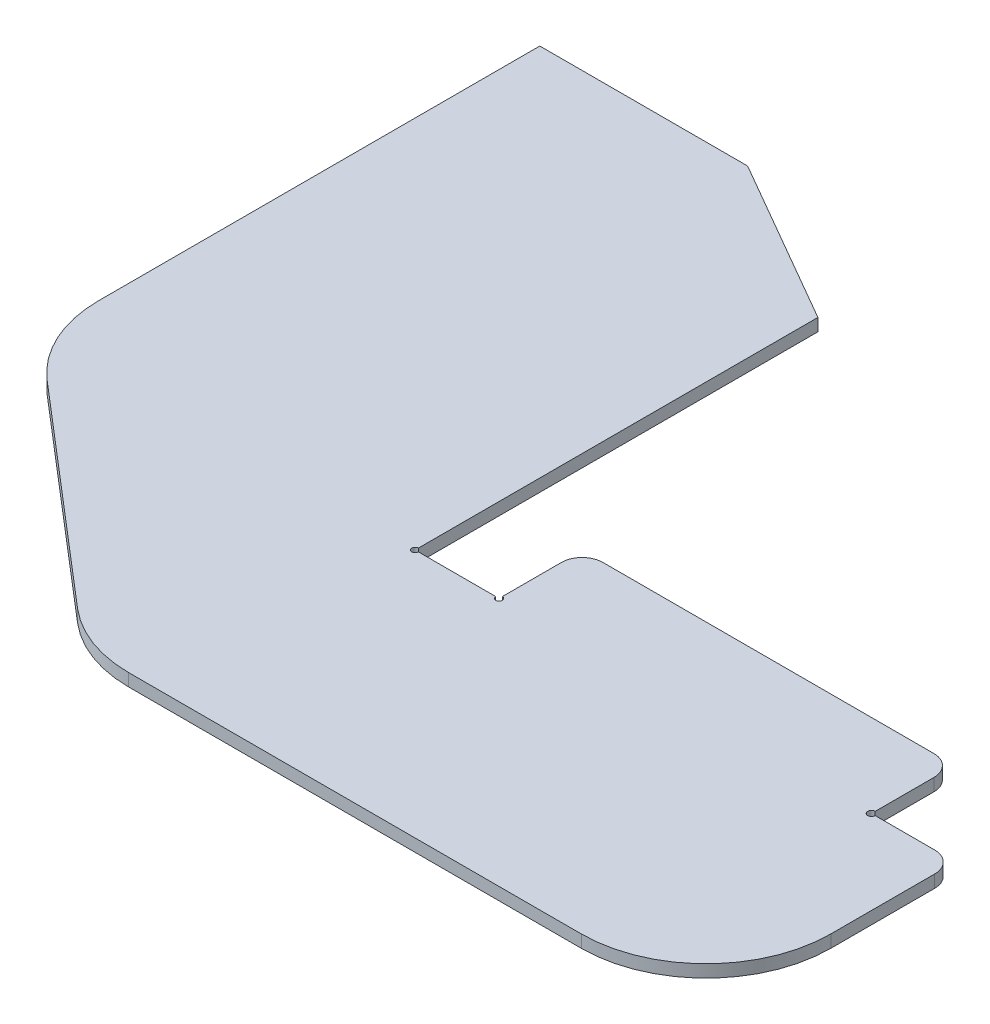
ISO-10303-21;
HEADER;
FILE_DESCRIPTION(('STEP AP214'),'2;1');
FILE_NAME('part.step','',(''),(''),'','','');
FILE_SCHEMA(('AUTOMOTIVE_DESIGN { 1 0 10303 214 1 1 1 1 }'));
ENDSEC;
DATA;
#1=APPLICATION_CONTEXT('core data for automotive mechanical design processes');
#2=APPLICATION_PROTOCOL_DEFINITION('international standard','automotive_design',2000,#1);
#3=PRODUCT_CONTEXT('',#1,'mechanical');
#4=PRODUCT('Part','Part','',(#3));
#5=PRODUCT_RELATED_PRODUCT_CATEGORY('part','',(#4));
#6=PRODUCT_DEFINITION_FORMATION('','',#4);
#7=PRODUCT_DEFINITION_CONTEXT('part definition',#1,'design');
#8=PRODUCT_DEFINITION('design','',#6,#7);
#9=PRODUCT_DEFINITION_SHAPE('','',#8);
#10=(LENGTH_UNIT() NAMED_UNIT(*) SI_UNIT(.MILLI.,.METRE.));
#11=(NAMED_UNIT(*) PLANE_ANGLE_UNIT() SI_UNIT($,.RADIAN.));
#12=(NAMED_UNIT(*) SI_UNIT($,.STERADIAN.) SOLID_ANGLE_UNIT());
#13=UNCERTAINTY_MEASURE_WITH_UNIT(LENGTH_MEASURE(1.E-05),#10,'distance_accuracy_value','');
#14=(GEOMETRIC_REPRESENTATION_CONTEXT(3) GLOBAL_UNCERTAINTY_ASSIGNED_CONTEXT((#13)) GLOBAL_UNIT_ASSIGNED_CONTEXT((#10,
#11,#12)) REPRESENTATION_CONTEXT('',''));
#15=CARTESIAN_POINT('',(0.,0.,0.));
#16=DIRECTION('',(0.,0.,1.));
#17=DIRECTION('',(1.,0.,0.));
#18=AXIS2_PLACEMENT_3D('',#15,#16,#17);
#19=CARTESIAN_POINT('',(-75.,3.,-30.));
#20=DIRECTION('',(0.,0.,1.));
#21=DIRECTION('',(1.,0.,0.));
#22=AXIS2_PLACEMENT_3D('',#19,#20,#21);
#23=PLANE('',#22);
#24=DIRECTION('',(-1.,0.,0.));
#25=VECTOR('',#24,1.);
#26=CARTESIAN_POINT('',(-75.,0.,-30.));
#27=LINE('',#26,#25);
#28=CARTESIAN_POINT('',(-35.6,0.,-30.));
#29=VERTEX_POINT('',#28);
#30=CARTESIAN_POINT('',(-54.2,0.,-30.));
#31=VERTEX_POINT('',#30);
#32=EDGE_CURVE('E278',#29,#31,#27,.T.);
#33=ORIENTED_EDGE('',*,*,#32,.T.);
#34=DIRECTION('',(0.,1.,0.));
#35=VECTOR('',#34,1.);
#36=CARTESIAN_POINT('',(-54.2,0.,-30.));
#37=LINE('',#36,#35);
#38=CARTESIAN_POINT('',(-54.2,3.,-30.));
#39=VERTEX_POINT('',#38);
#40=EDGE_CURVE('E234',#31,#39,#37,.T.);
#41=ORIENTED_EDGE('',*,*,#40,.T.);
#42=DIRECTION('',(-1.,0.,0.));
#43=VECTOR('',#42,1.);
#44=CARTESIAN_POINT('',(-75.,3.,-30.));
#45=LINE('',#44,#43);
#46=CARTESIAN_POINT('',(-35.6,3.,-30.));
#47=VERTEX_POINT('',#46);
#48=EDGE_CURVE('E269',#47,#39,#45,.T.);
#49=ORIENTED_EDGE('',*,*,#48,.F.);
#50=DIRECTION('',(0.,1.,0.));
#51=VECTOR('',#50,1.);
#52=CARTESIAN_POINT('',(-35.6,0.,-30.));
#53=LINE('',#52,#51);
#54=EDGE_CURVE('E231',#47,#29,#53,.F.);
#55=ORIENTED_EDGE('',*,*,#54,.T.);
#56=EDGE_LOOP('',(#33,#41,#49,#55));
#57=FACE_BOUND('',#56,.T.);
#58=ADVANCED_FACE('F35',(#57),#23,.F.);
#59=CARTESIAN_POINT('',(75.,3.,30.));
#60=DIRECTION('',(-1.,0.,0.));
#61=DIRECTION('',(0.,0.,1.));
#62=AXIS2_PLACEMENT_3D('',#59,#60,#61);
#63=PLANE('',#62);
#64=DIRECTION('',(0.,0.,-1.));
#65=VECTOR('',#64,1.);
#66=CARTESIAN_POINT('',(75.,0.,30.));
#67=LINE('',#66,#65);
#68=CARTESIAN_POINT('',(75.,0.,0.));
#69=VERTEX_POINT('',#68);
#70=CARTESIAN_POINT('',(75.,0.,-25.));
#71=VERTEX_POINT('',#70);
#72=EDGE_CURVE('E261',#69,#71,#67,.T.);
#73=ORIENTED_EDGE('',*,*,#72,.T.);
#74=DIRECTION('',(0.,-1.,0.));
#75=VECTOR('',#74,1.);
#76=CARTESIAN_POINT('',(75.,3.,-25.));
#77=LINE('',#76,#75);
#78=CARTESIAN_POINT('',(75.,3.,-25.));
#79=VERTEX_POINT('',#78);
#80=EDGE_CURVE('E326',#71,#79,#77,.F.);
#81=ORIENTED_EDGE('',*,*,#80,.T.);
#82=DIRECTION('',(0.,0.,-1.));
#83=VECTOR('',#82,1.);
#84=CARTESIAN_POINT('',(75.,3.,30.));
#85=LINE('',#84,#83);
#86=CARTESIAN_POINT('',(75.,3.,0.));
#87=VERTEX_POINT('',#86);
#88=EDGE_CURVE('E267',#87,#79,#85,.T.);
#89=ORIENTED_EDGE('',*,*,#88,.F.);
#90=DIRECTION('',(0.,-1.,0.));
#91=VECTOR('',#90,1.);
#92=CARTESIAN_POINT('',(75.,3.,0.));
#93=LINE('',#92,#91);
#94=EDGE_CURVE('E275',#87,#69,#93,.T.);
#95=ORIENTED_EDGE('',*,*,#94,.T.);
#96=EDGE_LOOP('',(#73,#81,#89,#95));
#97=FACE_BOUND('',#96,.T.);
#98=ADVANCED_FACE('F367',(#97),#63,.F.);
#99=CARTESIAN_POINT('',(70.,3.,-30.));
#100=VERTEX_POINT('',#99);
#101=CARTESIAN_POINT('',(55.6994021051872,3.,-30.));
#102=VERTEX_POINT('',#101);
#103=EDGE_CURVE('E271',#100,#102,#45,.T.);
#104=ORIENTED_EDGE('',*,*,#103,.F.);
#105=DIRECTION('',(0.,-1.,0.));
#106=VECTOR('',#105,1.);
#107=CARTESIAN_POINT('',(70.,3.,-30.));
#108=LINE('',#107,#106);
#109=CARTESIAN_POINT('',(70.,0.,-30.));
#110=VERTEX_POINT('',#109);
#111=EDGE_CURVE('E317',#100,#110,#108,.T.);
#112=ORIENTED_EDGE('',*,*,#111,.T.);
#113=CARTESIAN_POINT('',(55.6994021051872,0.,-30.));
#114=VERTEX_POINT('',#113);
#115=EDGE_CURVE('E279',#110,#114,#27,.T.);
#116=ORIENTED_EDGE('',*,*,#115,.T.);
#117=DIRECTION('',(0.,1.,0.));
#118=VECTOR('',#117,1.);
#119=CARTESIAN_POINT('',(55.6994021051872,0.,-30.));
#120=LINE('',#119,#118);
#121=EDGE_CURVE('E216',#114,#102,#120,.T.);
#122=ORIENTED_EDGE('',*,*,#121,.T.);
#123=EDGE_LOOP('',(#104,#112,#116,#122));
#124=FACE_BOUND('',#123,.T.);
#125=ADVANCED_FACE('F361',(#124),#23,.F.);
#126=CARTESIAN_POINT('',(-75.,3.,30.));
#127=DIRECTION('',(0.,0.,-1.));
#128=DIRECTION('',(-1.,0.,0.));
#129=AXIS2_PLACEMENT_3D('',#126,#127,#128);
#130=PLANE('',#129);
#131=DIRECTION('',(1.,0.,0.));
#132=VECTOR('',#131,1.);
#133=CARTESIAN_POINT('',(-75.,3.,30.));
#134=LINE('',#133,#132);
#135=CARTESIAN_POINT('',(-63.9022777135355,3.,30.));
#136=VERTEX_POINT('',#135);
#137=CARTESIAN_POINT('',(45.,3.,30.));
#138=VERTEX_POINT('',#137);
#139=EDGE_CURVE('E273',#136,#138,#134,.T.);
#140=ORIENTED_EDGE('',*,*,#139,.F.);
#141=DIRECTION('',(0.,-1.,0.));
#142=VECTOR('',#141,1.);
#143=CARTESIAN_POINT('',(-63.9022777135355,0.,30.));
#144=LINE('',#143,#142);
#145=CARTESIAN_POINT('',(-63.9022777135355,0.,30.));
#146=VERTEX_POINT('',#145);
#147=EDGE_CURVE('E292',#136,#146,#144,.T.);
#148=ORIENTED_EDGE('',*,*,#147,.T.);
#149=DIRECTION('',(1.,0.,0.));
#150=VECTOR('',#149,1.);
#151=CARTESIAN_POINT('',(-75.,0.,30.));
#152=LINE('',#151,#150);
#153=CARTESIAN_POINT('',(45.,0.,30.));
#154=VERTEX_POINT('',#153);
#155=EDGE_CURVE('E270',#146,#154,#152,.T.);
#156=ORIENTED_EDGE('',*,*,#155,.T.);
#157=DIRECTION('',(0.,-1.,0.));
#158=VECTOR('',#157,1.);
#159=CARTESIAN_POINT('',(45.,3.,30.));
#160=LINE('',#159,#158);
#161=EDGE_CURVE('E287',#154,#138,#160,.F.);
#162=ORIENTED_EDGE('',*,*,#161,.T.);
#163=EDGE_LOOP('',(#140,#148,#156,#162));
#164=FACE_BOUND('',#163,.T.);
#165=ADVANCED_FACE('F380',(#164),#130,.F.);
#166=CARTESIAN_POINT('',(0.,3.,0.));
#167=DIRECTION('',(0.,-1.,0.));
#168=DIRECTION('',(0.,0.,-1.));
#169=AXIS2_PLACEMENT_3D('',#166,#167,#168);
#170=PLANE('',#169);
#171=ORIENTED_EDGE('',*,*,#88,.T.);
#172=CARTESIAN_POINT('',(70.,3.,-25.));
#173=DIRECTION('',(0.,-1.,0.));
#174=DIRECTION('',(0.,0.,-1.));
#175=AXIS2_PLACEMENT_3D('',#172,#173,#174);
#176=CIRCLE('',#175,5.);
#177=EDGE_CURVE('E331',#79,#100,#176,.F.);
#178=ORIENTED_EDGE('',*,*,#177,.T.);
#179=ORIENTED_EDGE('',*,*,#103,.T.);
#180=CARTESIAN_POINT('',(54.8,3.,-30.));
#181=DIRECTION('',(0.,1.,0.));
#182=DIRECTION('',(0.,0.,1.));
#183=AXIS2_PLACEMENT_3D('',#180,#181,#182);
#184=CIRCLE('',#183,0.899402105187145);
#185=CARTESIAN_POINT('',(54.8,3.,-30.8994021051871));
#186=VERTEX_POINT('',#185);
#187=EDGE_CURVE('E189',#186,#102,#184,.T.);
#188=ORIENTED_EDGE('',*,*,#187,.F.);
#189=DIRECTION('',(0.,0.,-1.));
#190=VECTOR('',#189,1.);
#191=CARTESIAN_POINT('',(54.8,3.,0.));
#192=LINE('',#191,#190);
#193=CARTESIAN_POINT('',(54.8,3.,-45.));
#194=VERTEX_POINT('',#193);
#195=EDGE_CURVE('E241',#186,#194,#192,.T.);
#196=ORIENTED_EDGE('',*,*,#195,.T.);
#197=CARTESIAN_POINT('',(49.8,3.,-45.));
#198=DIRECTION('',(0.,-1.,0.));
#199=DIRECTION('',(0.,0.,-1.));
#200=AXIS2_PLACEMENT_3D('',#197,#198,#199);
#201=CIRCLE('',#200,5.);
#202=CARTESIAN_POINT('',(49.8,3.,-50.));
#203=VERTEX_POINT('',#202);
#204=EDGE_CURVE('E329',#194,#203,#201,.F.);
#205=ORIENTED_EDGE('',*,*,#204,.T.);
#206=DIRECTION('',(-1.,0.,0.));
#207=VECTOR('',#206,1.);
#208=CARTESIAN_POINT('',(0.,3.,-50.));
#209=LINE('',#208,#207);
#210=CARTESIAN_POINT('',(-29.8,3.,-50.));
#211=VERTEX_POINT('',#210);
#212=EDGE_CURVE('E238',#203,#211,#209,.T.);
#213=ORIENTED_EDGE('',*,*,#212,.T.);
#214=CARTESIAN_POINT('',(-29.8,3.,-45.));
#215=DIRECTION('',(0.,-1.,0.));
#216=DIRECTION('',(0.,0.,-1.));
#217=AXIS2_PLACEMENT_3D('',#214,#215,#216);
#218=CIRCLE('',#217,5.);
#219=CARTESIAN_POINT('',(-34.8,3.,-45.));
#220=VERTEX_POINT('',#219);
#221=EDGE_CURVE('E50',#211,#220,#218,.F.);
#222=ORIENTED_EDGE('',*,*,#221,.T.);
#223=DIRECTION('',(0.,0.,-1.));
#224=VECTOR('',#223,1.);
#225=CARTESIAN_POINT('',(-34.8,3.,0.));
#226=LINE('',#225,#224);
#227=CARTESIAN_POINT('',(-34.8,3.,-30.8));
#228=VERTEX_POINT('',#227);
#229=EDGE_CURVE('E237',#228,#220,#226,.T.);
#230=ORIENTED_EDGE('',*,*,#229,.F.);
#231=CARTESIAN_POINT('',(-34.8,3.,-30.));
#232=DIRECTION('',(0.,1.,0.));
#233=DIRECTION('',(0.,0.,1.));
#234=AXIS2_PLACEMENT_3D('',#231,#232,#233);
#235=CIRCLE('',#234,0.800000000000003);
#236=EDGE_CURVE('E222',#47,#228,#235,.T.);
#237=ORIENTED_EDGE('',*,*,#236,.F.);
#238=ORIENTED_EDGE('',*,*,#48,.T.);
#239=CARTESIAN_POINT('',(-55.,3.,-30.));
#240=DIRECTION('',(0.,1.,0.));
#241=DIRECTION('',(0.,0.,1.));
#242=AXIS2_PLACEMENT_3D('',#239,#240,#241);
#243=CIRCLE('',#242,0.800000000000003);
#244=CARTESIAN_POINT('',(-55.,3.,-30.8));
#245=VERTEX_POINT('',#244);
#246=EDGE_CURVE('E217',#245,#39,#243,.T.);
#247=ORIENTED_EDGE('',*,*,#246,.F.);
#248=DIRECTION('',(0.,0.,-1.));
#249=VECTOR('',#248,1.);
#250=CARTESIAN_POINT('',(-55.,3.,0.));
#251=LINE('',#250,#249);
#252=CARTESIAN_POINT('',(-55.,3.,-126.905989232415));
#253=VERTEX_POINT('',#252);
#254=EDGE_CURVE('E204',#245,#253,#251,.T.);
#255=ORIENTED_EDGE('',*,*,#254,.T.);
#256=DIRECTION('',(-0.86602540378444,0.,-0.499999999999997));
#257=VECTOR('',#256,1.);
#258=CARTESIAN_POINT('',(-94.9999999999994,3.,-150.));
#259=LINE('',#258,#257);
#260=CARTESIAN_POINT('',(-94.9999999999994,3.,-150.));
#261=VERTEX_POINT('',#260);
#262=EDGE_CURVE('E195',#253,#261,#259,.T.);
#263=ORIENTED_EDGE('',*,*,#262,.T.);
#264=DIRECTION('',(-1.,0.,0.));
#265=VECTOR('',#264,1.);
#266=CARTESIAN_POINT('',(-145.,3.,-150.));
#267=LINE('',#266,#265);
#268=CARTESIAN_POINT('',(-145.,3.,-150.));
#269=VERTEX_POINT('',#268);
#270=EDGE_CURVE('E179',#261,#269,#267,.T.);
#271=ORIENTED_EDGE('',*,*,#270,.T.);
#272=DIRECTION('',(0.,0.,-1.));
#273=VECTOR('',#272,1.);
#274=CARTESIAN_POINT('',(-145.,3.,0.));
#275=LINE('',#274,#273);
#276=CARTESIAN_POINT('',(-145.,3.,-43.7980476741124));
#277=VERTEX_POINT('',#276);
#278=EDGE_CURVE('E259',#277,#269,#275,.T.);
#279=ORIENTED_EDGE('',*,*,#278,.F.);
#280=CARTESIAN_POINT('',(-115.,3.,-43.7980476741124));
#281=DIRECTION('',(0.,-1.,0.));
#282=DIRECTION('',(0.,0.,-1.));
#283=AXIS2_PLACEMENT_3D('',#280,#281,#282);
#284=CIRCLE('',#283,30.);
#285=CARTESIAN_POINT('',(-134.523741203679,3.,-21.0203496031535));
#286=VERTEX_POINT('',#285);
#287=EDGE_CURVE('E303',#277,#286,#284,.F.);
#288=ORIENTED_EDGE('',*,*,#287,.T.);
#289=DIRECTION('',(0.759256602365297,0.,0.650791373455968));
#290=VECTOR('',#289,1.);
#291=CARTESIAN_POINT('',(-46.5882352941176,3.,54.3529411764706));
#292=LINE('',#291,#290);
#293=CARTESIAN_POINT('',(-83.4260189172146,3.,22.7776980709589));
#294=VERTEX_POINT('',#293);
#295=EDGE_CURVE('E256',#286,#294,#292,.T.);
#296=ORIENTED_EDGE('',*,*,#295,.T.);
#297=CARTESIAN_POINT('',(-63.9022777135355,3.,0.));
#298=DIRECTION('',(0.,-1.,0.));
#299=DIRECTION('',(0.,0.,-1.));
#300=AXIS2_PLACEMENT_3D('',#297,#298,#299);
#301=CIRCLE('',#300,30.);
#302=EDGE_CURVE('E305',#294,#136,#301,.F.);
#303=ORIENTED_EDGE('',*,*,#302,.T.);
#304=ORIENTED_EDGE('',*,*,#139,.T.);
#305=CARTESIAN_POINT('',(45.,3.,0.));
#306=DIRECTION('',(0.,-1.,0.));
#307=DIRECTION('',(0.,0.,-1.));
#308=AXIS2_PLACEMENT_3D('',#305,#306,#307);
#309=CIRCLE('',#308,30.);
#310=EDGE_CURVE('E290',#138,#87,#309,.F.);
#311=ORIENTED_EDGE('',*,*,#310,.T.);
#312=EDGE_LOOP('',(#171,#178,#179,#188,#196,#205,#213,#222,#230,#237,#238,#247,#255,#263,#271,
#279,#288,#296,#303,#304,#311));
#313=FACE_BOUND('',#312,.T.);
#314=ADVANCED_FACE('F201',(#313),#170,.F.);
#315=CARTESIAN_POINT('',(0.,0.,0.));
#316=DIRECTION('',(0.,-1.,0.));
#317=DIRECTION('',(0.,0.,-1.));
#318=AXIS2_PLACEMENT_3D('',#315,#316,#317);
#319=PLANE('',#318);
#320=ORIENTED_EDGE('',*,*,#115,.F.);
#321=CARTESIAN_POINT('',(70.,0.,-25.));
#322=DIRECTION('',(0.,-1.,0.));
#323=DIRECTION('',(0.,0.,-1.));
#324=AXIS2_PLACEMENT_3D('',#321,#322,#323);
#325=CIRCLE('',#324,5.);
#326=EDGE_CURVE('E324',#110,#71,#325,.T.);
#327=ORIENTED_EDGE('',*,*,#326,.T.);
#328=ORIENTED_EDGE('',*,*,#72,.F.);
#329=CARTESIAN_POINT('',(45.,0.,0.));
#330=DIRECTION('',(0.,-1.,0.));
#331=DIRECTION('',(0.,0.,-1.));
#332=AXIS2_PLACEMENT_3D('',#329,#330,#331);
#333=CIRCLE('',#332,30.);
#334=EDGE_CURVE('E284',#69,#154,#333,.T.);
#335=ORIENTED_EDGE('',*,*,#334,.T.);
#336=ORIENTED_EDGE('',*,*,#155,.F.);
#337=CARTESIAN_POINT('',(-63.9022777135355,0.,0.));
#338=DIRECTION('',(0.,-1.,0.));
#339=DIRECTION('',(0.,0.,-1.));
#340=AXIS2_PLACEMENT_3D('',#337,#338,#339);
#341=CIRCLE('',#340,30.);
#342=CARTESIAN_POINT('',(-83.4260189172146,0.,22.7776980709589));
#343=VERTEX_POINT('',#342);
#344=EDGE_CURVE('E297',#146,#343,#341,.T.);
#345=ORIENTED_EDGE('',*,*,#344,.T.);
#346=DIRECTION('',(0.759256602365297,0.,0.650791373455968));
#347=VECTOR('',#346,1.);
#348=CARTESIAN_POINT('',(-46.5882352941176,0.,54.3529411764706));
#349=LINE('',#348,#347);
#350=CARTESIAN_POINT('',(-134.523741203679,0.,-21.0203496031535));
#351=VERTEX_POINT('',#350);
#352=EDGE_CURVE('E255',#351,#343,#349,.T.);
#353=ORIENTED_EDGE('',*,*,#352,.F.);
#354=CARTESIAN_POINT('',(-115.,0.,-43.7980476741124));
#355=DIRECTION('',(0.,-1.,0.));
#356=DIRECTION('',(0.,0.,-1.));
#357=AXIS2_PLACEMENT_3D('',#354,#355,#356);
#358=CIRCLE('',#357,30.);
#359=CARTESIAN_POINT('',(-145.,0.,-43.7980476741124));
#360=VERTEX_POINT('',#359);
#361=EDGE_CURVE('E295',#351,#360,#358,.T.);
#362=ORIENTED_EDGE('',*,*,#361,.T.);
#363=DIRECTION('',(0.,0.,-1.));
#364=VECTOR('',#363,1.);
#365=CARTESIAN_POINT('',(-145.,0.,0.));
#366=LINE('',#365,#364);
#367=CARTESIAN_POINT('',(-145.,0.,-150.));
#368=VERTEX_POINT('',#367);
#369=EDGE_CURVE('E253',#360,#368,#366,.T.);
#370=ORIENTED_EDGE('',*,*,#369,.T.);
#371=DIRECTION('',(1.,0.,0.));
#372=VECTOR('',#371,1.);
#373=CARTESIAN_POINT('',(-145.,0.,-150.));
#374=LINE('',#373,#372);
#375=CARTESIAN_POINT('',(-94.9999999999994,0.,-150.));
#376=VERTEX_POINT('',#375);
#377=EDGE_CURVE('E198',#368,#376,#374,.T.);
#378=ORIENTED_EDGE('',*,*,#377,.T.);
#379=DIRECTION('',(-0.86602540378444,0.,-0.499999999999997));
#380=VECTOR('',#379,1.);
#381=CARTESIAN_POINT('',(-94.9999999999994,0.,-150.));
#382=LINE('',#381,#380);
#383=CARTESIAN_POINT('',(-55.,0.,-126.905989232415));
#384=VERTEX_POINT('',#383);
#385=EDGE_CURVE('E197',#384,#376,#382,.T.);
#386=ORIENTED_EDGE('',*,*,#385,.F.);
#387=DIRECTION('',(0.,0.,-1.));
#388=VECTOR('',#387,1.);
#389=CARTESIAN_POINT('',(-55.,0.,0.));
#390=LINE('',#389,#388);
#391=CARTESIAN_POINT('',(-55.,0.,-30.8));
#392=VERTEX_POINT('',#391);
#393=EDGE_CURVE('E262',#392,#384,#390,.T.);
#394=ORIENTED_EDGE('',*,*,#393,.F.);
#395=CARTESIAN_POINT('',(-55.,0.,-30.));
#396=DIRECTION('',(0.,1.,0.));
#397=DIRECTION('',(0.,0.,1.));
#398=AXIS2_PLACEMENT_3D('',#395,#396,#397);
#399=CIRCLE('',#398,0.800000000000003);
#400=EDGE_CURVE('E213',#392,#31,#399,.T.);
#401=ORIENTED_EDGE('',*,*,#400,.T.);
#402=ORIENTED_EDGE('',*,*,#32,.F.);
#403=CARTESIAN_POINT('',(-34.8,0.,-30.));
#404=DIRECTION('',(0.,1.,0.));
#405=DIRECTION('',(0.,0.,1.));
#406=AXIS2_PLACEMENT_3D('',#403,#404,#405);
#407=CIRCLE('',#406,0.800000000000003);
#408=CARTESIAN_POINT('',(-34.8,0.,-30.8));
#409=VERTEX_POINT('',#408);
#410=EDGE_CURVE('E219',#29,#409,#407,.T.);
#411=ORIENTED_EDGE('',*,*,#410,.T.);
#412=DIRECTION('',(0.,0.,-1.));
#413=VECTOR('',#412,1.);
#414=CARTESIAN_POINT('',(-34.8,0.,0.));
#415=LINE('',#414,#413);
#416=CARTESIAN_POINT('',(-34.8,0.,-45.));
#417=VERTEX_POINT('',#416);
#418=EDGE_CURVE('E240',#409,#417,#415,.T.);
#419=ORIENTED_EDGE('',*,*,#418,.T.);
#420=CARTESIAN_POINT('',(-29.8,0.,-45.));
#421=DIRECTION('',(0.,-1.,0.));
#422=DIRECTION('',(0.,0.,-1.));
#423=AXIS2_PLACEMENT_3D('',#420,#421,#422);
#424=CIRCLE('',#423,5.);
#425=CARTESIAN_POINT('',(-29.8,0.,-50.));
#426=VERTEX_POINT('',#425);
#427=EDGE_CURVE('E320',#417,#426,#424,.T.);
#428=ORIENTED_EDGE('',*,*,#427,.T.);
#429=DIRECTION('',(-1.,0.,0.));
#430=VECTOR('',#429,1.);
#431=CARTESIAN_POINT('',(0.,0.,-50.));
#432=LINE('',#431,#430);
#433=CARTESIAN_POINT('',(49.8,0.,-50.));
#434=VERTEX_POINT('',#433);
#435=EDGE_CURVE('E246',#434,#426,#432,.T.);
#436=ORIENTED_EDGE('',*,*,#435,.F.);
#437=CARTESIAN_POINT('',(49.8,0.,-45.));
#438=DIRECTION('',(0.,-1.,0.));
#439=DIRECTION('',(0.,0.,-1.));
#440=AXIS2_PLACEMENT_3D('',#437,#438,#439);
#441=CIRCLE('',#440,5.);
#442=CARTESIAN_POINT('',(54.8,0.,-45.));
#443=VERTEX_POINT('',#442);
#444=EDGE_CURVE('E322',#434,#443,#441,.T.);
#445=ORIENTED_EDGE('',*,*,#444,.T.);
#446=DIRECTION('',(0.,0.,-1.));
#447=VECTOR('',#446,1.);
#448=CARTESIAN_POINT('',(54.8,0.,0.));
#449=LINE('',#448,#447);
#450=CARTESIAN_POINT('',(54.8,0.,-30.8994021051871));
#451=VERTEX_POINT('',#450);
#452=EDGE_CURVE('E244',#451,#443,#449,.T.);
#453=ORIENTED_EDGE('',*,*,#452,.F.);
#454=CARTESIAN_POINT('',(54.8,0.,-30.));
#455=DIRECTION('',(0.,1.,0.));
#456=DIRECTION('',(0.,0.,1.));
#457=AXIS2_PLACEMENT_3D('',#454,#455,#456);
#458=CIRCLE('',#457,0.899402105187145);
#459=EDGE_CURVE('E224',#451,#114,#458,.T.);
#460=ORIENTED_EDGE('',*,*,#459,.T.);
#461=EDGE_LOOP('',(#320,#327,#328,#335,#336,#345,#353,#362,#370,#378,#386,#394,#401,#402,#411,
#419,#428,#436,#445,#453,#460));
#462=FACE_BOUND('',#461,.T.);
#463=ADVANCED_FACE('F346',(#462),#319,.T.);
#464=CARTESIAN_POINT('',(45.,3.,0.));
#465=DIRECTION('',(0.,-1.,0.));
#466=DIRECTION('',(0.,0.,-1.));
#467=AXIS2_PLACEMENT_3D('',#464,#465,#466);
#468=CYLINDRICAL_SURFACE('',#467,30.);
#469=ORIENTED_EDGE('',*,*,#310,.F.);
#470=ORIENTED_EDGE('',*,*,#161,.F.);
#471=ORIENTED_EDGE('',*,*,#334,.F.);
#472=ORIENTED_EDGE('',*,*,#94,.F.);
#473=EDGE_LOOP('',(#469,#470,#471,#472));
#474=FACE_BOUND('',#473,.T.);
#475=ADVANCED_FACE('F374',(#474),#468,.T.);
#476=CARTESIAN_POINT('',(-46.5882352941176,-120.415945787923,54.3529411764706));
#477=DIRECTION('',(-0.650791373455968,0.,0.759256602365297));
#478=DIRECTION('',(0.759256602365297,0.,0.650791373455968));
#479=AXIS2_PLACEMENT_3D('',#476,#477,#478);
#480=PLANE('',#479);
#481=ORIENTED_EDGE('',*,*,#352,.T.);
#482=DIRECTION('',(0.,-1.,0.));
#483=VECTOR('',#482,1.);
#484=CARTESIAN_POINT('',(-83.4260189172146,3.,22.7776980709589));
#485=LINE('',#484,#483);
#486=EDGE_CURVE('E301',#343,#294,#485,.F.);
#487=ORIENTED_EDGE('',*,*,#486,.T.);
#488=ORIENTED_EDGE('',*,*,#295,.F.);
#489=DIRECTION('',(0.,1.,0.));
#490=VECTOR('',#489,1.);
#491=CARTESIAN_POINT('',(-134.523741203679,0.,-21.0203496031535));
#492=LINE('',#491,#490);
#493=EDGE_CURVE('E299',#286,#351,#492,.F.);
#494=ORIENTED_EDGE('',*,*,#493,.T.);
#495=EDGE_LOOP('',(#481,#487,#488,#494));
#496=FACE_BOUND('',#495,.T.);
#497=ADVANCED_FACE('F388',(#496),#480,.T.);
#498=CARTESIAN_POINT('',(-55.,-120.415945787923,0.));
#499=DIRECTION('',(1.,0.,0.));
#500=DIRECTION('',(0.,0.,-1.));
#501=AXIS2_PLACEMENT_3D('',#498,#499,#500);
#502=PLANE('',#501);
#503=DIRECTION('',(0.,1.,0.));
#504=VECTOR('',#503,1.);
#505=CARTESIAN_POINT('',(-55.,0.,-30.8));
#506=LINE('',#505,#504);
#507=EDGE_CURVE('E315',#392,#245,#506,.T.);
#508=ORIENTED_EDGE('',*,*,#507,.F.);
#509=ORIENTED_EDGE('',*,*,#393,.T.);
#510=DIRECTION('',(0.,1.,0.));
#511=VECTOR('',#510,1.);
#512=CARTESIAN_POINT('',(-55.,-122.065556157337,-126.905989232415));
#513=LINE('',#512,#511);
#514=EDGE_CURVE('E206',#384,#253,#513,.T.);
#515=ORIENTED_EDGE('',*,*,#514,.T.);
#516=ORIENTED_EDGE('',*,*,#254,.F.);
#517=EDGE_LOOP('',(#508,#509,#515,#516));
#518=FACE_BOUND('',#517,.T.);
#519=ADVANCED_FACE('F400',(#518),#502,.T.);
#520=CARTESIAN_POINT('',(-145.,-120.415945787923,0.));
#521=DIRECTION('',(1.,0.,0.));
#522=DIRECTION('',(0.,0.,-1.));
#523=AXIS2_PLACEMENT_3D('',#520,#521,#522);
#524=PLANE('',#523);
#525=ORIENTED_EDGE('',*,*,#369,.F.);
#526=DIRECTION('',(0.,1.,0.));
#527=VECTOR('',#526,1.);
#528=CARTESIAN_POINT('',(-145.,3.,-43.7980476741124));
#529=LINE('',#528,#527);
#530=EDGE_CURVE('E307',#360,#277,#529,.T.);
#531=ORIENTED_EDGE('',*,*,#530,.T.);
#532=ORIENTED_EDGE('',*,*,#278,.T.);
#533=DIRECTION('',(0.,-1.,0.));
#534=VECTOR('',#533,1.);
#535=CARTESIAN_POINT('',(-145.,104.980390271856,-150.));
#536=LINE('',#535,#534);
#537=EDGE_CURVE('E186',#269,#368,#536,.T.);
#538=ORIENTED_EDGE('',*,*,#537,.T.);
#539=EDGE_LOOP('',(#525,#531,#532,#538));
#540=FACE_BOUND('',#539,.T.);
#541=ADVANCED_FACE('F396',(#540),#524,.F.);
#542=CARTESIAN_POINT('',(-34.8,-120.415945787923,0.));
#543=DIRECTION('',(1.,0.,0.));
#544=DIRECTION('',(0.,0.,-1.));
#545=AXIS2_PLACEMENT_3D('',#542,#543,#544);
#546=PLANE('',#545);
#547=ORIENTED_EDGE('',*,*,#229,.T.);
#548=DIRECTION('',(0.,1.,0.));
#549=VECTOR('',#548,1.);
#550=CARTESIAN_POINT('',(-34.8,0.,-45.));
#551=LINE('',#550,#549);
#552=EDGE_CURVE('E11',#220,#417,#551,.F.);
#553=ORIENTED_EDGE('',*,*,#552,.T.);
#554=ORIENTED_EDGE('',*,*,#418,.F.);
#555=DIRECTION('',(0.,1.,0.));
#556=VECTOR('',#555,1.);
#557=CARTESIAN_POINT('',(-34.8,0.,-30.8));
#558=LINE('',#557,#556);
#559=EDGE_CURVE('E312',#409,#228,#558,.T.);
#560=ORIENTED_EDGE('',*,*,#559,.T.);
#561=EDGE_LOOP('',(#547,#553,#554,#560));
#562=FACE_BOUND('',#561,.T.);
#563=ADVANCED_FACE('F412',(#562),#546,.F.);
#564=CARTESIAN_POINT('',(0.,-120.415945787923,-50.));
#565=DIRECTION('',(0.,0.,-1.));
#566=DIRECTION('',(-1.,0.,0.));
#567=AXIS2_PLACEMENT_3D('',#564,#565,#566);
#568=PLANE('',#567);
#569=ORIENTED_EDGE('',*,*,#212,.F.);
#570=DIRECTION('',(0.,1.,0.));
#571=VECTOR('',#570,1.);
#572=CARTESIAN_POINT('',(49.8,-120.415945787923,-50.));
#573=LINE('',#572,#571);
#574=EDGE_CURVE('E43',#203,#434,#573,.F.);
#575=ORIENTED_EDGE('',*,*,#574,.T.);
#576=ORIENTED_EDGE('',*,*,#435,.T.);
#577=DIRECTION('',(0.,1.,0.));
#578=VECTOR('',#577,1.);
#579=CARTESIAN_POINT('',(-29.8,3.,-50.));
#580=LINE('',#579,#578);
#581=EDGE_CURVE('E336',#426,#211,#580,.T.);
#582=ORIENTED_EDGE('',*,*,#581,.T.);
#583=EDGE_LOOP('',(#569,#575,#576,#582));
#584=FACE_BOUND('',#583,.T.);
#585=ADVANCED_FACE('F341',(#584),#568,.T.);
#586=CARTESIAN_POINT('',(54.8,-120.415945787923,0.));
#587=DIRECTION('',(1.,0.,0.));
#588=DIRECTION('',(0.,0.,-1.));
#589=AXIS2_PLACEMENT_3D('',#586,#587,#588);
#590=PLANE('',#589);
#591=ORIENTED_EDGE('',*,*,#452,.T.);
#592=DIRECTION('',(0.,1.,0.));
#593=VECTOR('',#592,1.);
#594=CARTESIAN_POINT('',(54.8,-120.415945787923,-45.));
#595=LINE('',#594,#593);
#596=EDGE_CURVE('E333',#443,#194,#595,.T.);
#597=ORIENTED_EDGE('',*,*,#596,.T.);
#598=ORIENTED_EDGE('',*,*,#195,.F.);
#599=DIRECTION('',(0.,1.,0.));
#600=VECTOR('',#599,1.);
#601=CARTESIAN_POINT('',(54.8,0.,-30.8994021051871));
#602=LINE('',#601,#600);
#603=EDGE_CURVE('E310',#451,#186,#602,.T.);
#604=ORIENTED_EDGE('',*,*,#603,.F.);
#605=EDGE_LOOP('',(#591,#597,#598,#604));
#606=FACE_BOUND('',#605,.T.);
#607=ADVANCED_FACE('F353',(#606),#590,.T.);
#608=CARTESIAN_POINT('',(-63.9022777135355,3.,0.));
#609=DIRECTION('',(0.,1.,0.));
#610=DIRECTION('',(0.,0.,1.));
#611=AXIS2_PLACEMENT_3D('',#608,#609,#610);
#612=CYLINDRICAL_SURFACE('',#611,30.);
#613=ORIENTED_EDGE('',*,*,#302,.F.);
#614=ORIENTED_EDGE('',*,*,#486,.F.);
#615=ORIENTED_EDGE('',*,*,#344,.F.);
#616=ORIENTED_EDGE('',*,*,#147,.F.);
#617=EDGE_LOOP('',(#613,#614,#615,#616));
#618=FACE_BOUND('',#617,.T.);
#619=ADVANCED_FACE('F384',(#618),#612,.T.);
#620=CARTESIAN_POINT('',(-115.,-120.415945787923,-43.7980476741124));
#621=DIRECTION('',(0.,-1.,0.));
#622=DIRECTION('',(0.,0.,-1.));
#623=AXIS2_PLACEMENT_3D('',#620,#621,#622);
#624=CYLINDRICAL_SURFACE('',#623,30.);
#625=ORIENTED_EDGE('',*,*,#361,.F.);
#626=ORIENTED_EDGE('',*,*,#493,.F.);
#627=ORIENTED_EDGE('',*,*,#287,.F.);
#628=ORIENTED_EDGE('',*,*,#530,.F.);
#629=EDGE_LOOP('',(#625,#626,#627,#628));
#630=FACE_BOUND('',#629,.T.);
#631=ADVANCED_FACE('F393',(#630),#624,.T.);
#632=CARTESIAN_POINT('',(54.8,0.,-30.));
#633=DIRECTION('',(0.,1.,0.));
#634=DIRECTION('',(0.,0.,1.));
#635=AXIS2_PLACEMENT_3D('',#632,#633,#634);
#636=CYLINDRICAL_SURFACE('',#635,0.899402105187145);
#637=ORIENTED_EDGE('',*,*,#459,.F.);
#638=ORIENTED_EDGE('',*,*,#603,.T.);
#639=ORIENTED_EDGE('',*,*,#187,.T.);
#640=ORIENTED_EDGE('',*,*,#121,.F.);
#641=EDGE_LOOP('',(#637,#638,#639,#640));
#642=FACE_BOUND('',#641,.T.);
#643=ADVANCED_FACE('F359',(#642),#636,.F.);
#644=CARTESIAN_POINT('',(-34.8,0.,-30.));
#645=DIRECTION('',(0.,1.,0.));
#646=DIRECTION('',(0.,0.,1.));
#647=AXIS2_PLACEMENT_3D('',#644,#645,#646);
#648=CYLINDRICAL_SURFACE('',#647,0.800000000000003);
#649=ORIENTED_EDGE('',*,*,#236,.T.);
#650=ORIENTED_EDGE('',*,*,#559,.F.);
#651=ORIENTED_EDGE('',*,*,#410,.F.);
#652=ORIENTED_EDGE('',*,*,#54,.F.);
#653=EDGE_LOOP('',(#649,#650,#651,#652));
#654=FACE_BOUND('',#653,.T.);
#655=ADVANCED_FACE('F451',(#654),#648,.F.);
#656=CARTESIAN_POINT('',(-55.,0.,-30.));
#657=DIRECTION('',(0.,1.,0.));
#658=DIRECTION('',(0.,0.,1.));
#659=AXIS2_PLACEMENT_3D('',#656,#657,#658);
#660=CYLINDRICAL_SURFACE('',#659,0.800000000000003);
#661=ORIENTED_EDGE('',*,*,#400,.F.);
#662=ORIENTED_EDGE('',*,*,#507,.T.);
#663=ORIENTED_EDGE('',*,*,#246,.T.);
#664=ORIENTED_EDGE('',*,*,#40,.F.);
#665=EDGE_LOOP('',(#661,#662,#663,#664));
#666=FACE_BOUND('',#665,.T.);
#667=ADVANCED_FACE('F402',(#666),#660,.F.);
#668=CARTESIAN_POINT('',(70.,3.,-25.));
#669=DIRECTION('',(0.,-1.,0.));
#670=DIRECTION('',(0.,0.,-1.));
#671=AXIS2_PLACEMENT_3D('',#668,#669,#670);
#672=CYLINDRICAL_SURFACE('',#671,5.);
#673=ORIENTED_EDGE('',*,*,#177,.F.);
#674=ORIENTED_EDGE('',*,*,#80,.F.);
#675=ORIENTED_EDGE('',*,*,#326,.F.);
#676=ORIENTED_EDGE('',*,*,#111,.F.);
#677=EDGE_LOOP('',(#673,#674,#675,#676));
#678=FACE_BOUND('',#677,.T.);
#679=ADVANCED_FACE('F371',(#678),#672,.T.);
#680=CARTESIAN_POINT('',(49.8,-120.415945787923,-45.));
#681=DIRECTION('',(0.,1.,0.));
#682=DIRECTION('',(0.,0.,1.));
#683=AXIS2_PLACEMENT_3D('',#680,#681,#682);
#684=CYLINDRICAL_SURFACE('',#683,5.);
#685=ORIENTED_EDGE('',*,*,#444,.F.);
#686=ORIENTED_EDGE('',*,*,#574,.F.);
#687=ORIENTED_EDGE('',*,*,#204,.F.);
#688=ORIENTED_EDGE('',*,*,#596,.F.);
#689=EDGE_LOOP('',(#685,#686,#687,#688));
#690=FACE_BOUND('',#689,.T.);
#691=ADVANCED_FACE('F350',(#690),#684,.T.);
#692=CARTESIAN_POINT('',(-29.8,-120.415945787923,-45.));
#693=DIRECTION('',(0.,-1.,0.));
#694=DIRECTION('',(0.,0.,-1.));
#695=AXIS2_PLACEMENT_3D('',#692,#693,#694);
#696=CYLINDRICAL_SURFACE('',#695,5.);
#697=ORIENTED_EDGE('',*,*,#427,.F.);
#698=ORIENTED_EDGE('',*,*,#552,.F.);
#699=ORIENTED_EDGE('',*,*,#221,.F.);
#700=ORIENTED_EDGE('',*,*,#581,.F.);
#701=EDGE_LOOP('',(#697,#698,#699,#700));
#702=FACE_BOUND('',#701,.T.);
#703=ADVANCED_FACE('F37',(#702),#696,.T.);
#704=CARTESIAN_POINT('',(-145.,104.980390271856,-150.));
#705=DIRECTION('',(0.,0.,-1.));
#706=DIRECTION('',(-1.,0.,0.));
#707=AXIS2_PLACEMENT_3D('',#704,#705,#706);
#708=PLANE('',#707);
#709=ORIENTED_EDGE('',*,*,#270,.F.);
#710=DIRECTION('',(0.,1.,0.));
#711=VECTOR('',#710,1.);
#712=CARTESIAN_POINT('',(-94.9999999999994,-122.065556157337,-150.));
#713=LINE('',#712,#711);
#714=EDGE_CURVE('E183',#376,#261,#713,.T.);
#715=ORIENTED_EDGE('',*,*,#714,.F.);
#716=ORIENTED_EDGE('',*,*,#377,.F.);
#717=ORIENTED_EDGE('',*,*,#537,.F.);
#718=EDGE_LOOP('',(#709,#715,#716,#717));
#719=FACE_BOUND('',#718,.T.);
#720=ADVANCED_FACE('F181',(#719),#708,.T.);
#721=CARTESIAN_POINT('',(-94.9999999999994,-122.065556157337,-150.));
#722=DIRECTION('',(0.499999999999997,0.,-0.86602540378444));
#723=DIRECTION('',(-0.86602540378444,0.,-0.499999999999997));
#724=AXIS2_PLACEMENT_3D('',#721,#722,#723);
#725=PLANE('',#724);
#726=ORIENTED_EDGE('',*,*,#514,.F.);
#727=ORIENTED_EDGE('',*,*,#385,.T.);
#728=ORIENTED_EDGE('',*,*,#714,.T.);
#729=ORIENTED_EDGE('',*,*,#262,.F.);
#730=EDGE_LOOP('',(#726,#727,#728,#729));
#731=FACE_BOUND('',#730,.T.);
#732=ADVANCED_FACE('F194',(#731),#725,.T.);
#733=CLOSED_SHELL('',(#58,#98,#125,#165,#314,#463,#475,#497,#519,#541,#563,#585,#607,#619,#631,
#643,#655,#667,#679,#691,#703,#720,#732));
#734=MANIFOLD_SOLID_BREP('B2',#733);
#735=ADVANCED_BREP_SHAPE_REPRESENTATION('',(#18,#734),#14);
#736=SHAPE_DEFINITION_REPRESENTATION(#9,#735);
ENDSEC;
END-ISO-10303-21;
